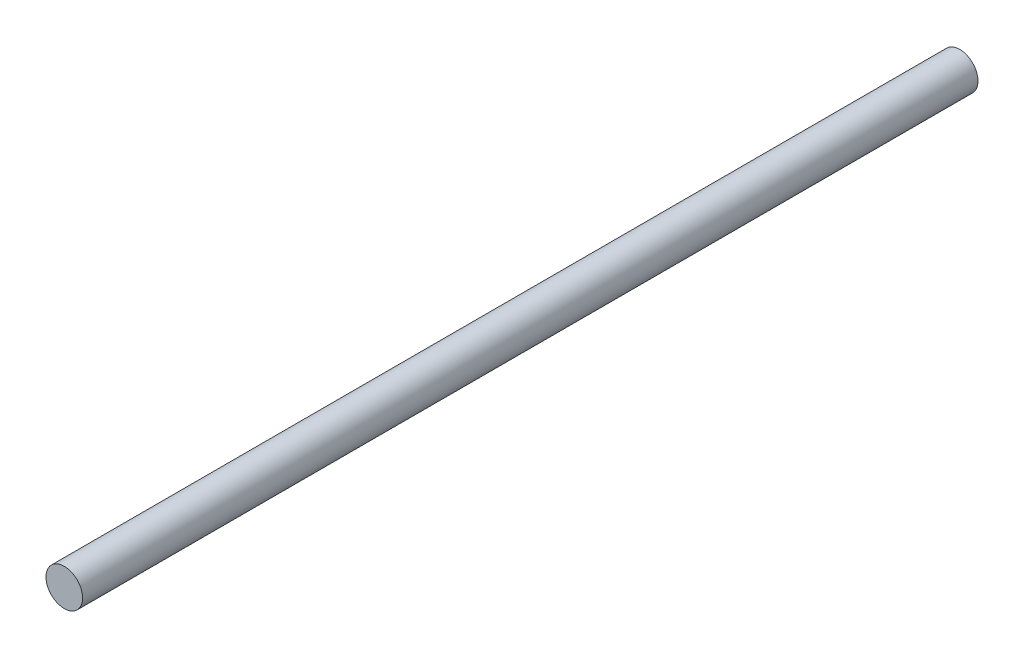
ISO-10303-21;
HEADER;
FILE_DESCRIPTION(('STEP AP214'),'2;1');
FILE_NAME('part.step','',(''),(''),'','','');
FILE_SCHEMA(('AUTOMOTIVE_DESIGN { 1 0 10303 214 1 1 1 1 }'));
ENDSEC;
DATA;
#1=APPLICATION_CONTEXT('core data for automotive mechanical design processes');
#2=APPLICATION_PROTOCOL_DEFINITION('international standard','automotive_design',2000,#1);
#3=PRODUCT_CONTEXT('',#1,'mechanical');
#4=PRODUCT('Part','Part','',(#3));
#5=PRODUCT_RELATED_PRODUCT_CATEGORY('part','',(#4));
#6=PRODUCT_DEFINITION_FORMATION('','',#4);
#7=PRODUCT_DEFINITION_CONTEXT('part definition',#1,'design');
#8=PRODUCT_DEFINITION('design','',#6,#7);
#9=PRODUCT_DEFINITION_SHAPE('','',#8);
#10=(LENGTH_UNIT() NAMED_UNIT(*) SI_UNIT(.MILLI.,.METRE.));
#11=(NAMED_UNIT(*) PLANE_ANGLE_UNIT() SI_UNIT($,.RADIAN.));
#12=(NAMED_UNIT(*) SI_UNIT($,.STERADIAN.) SOLID_ANGLE_UNIT());
#13=UNCERTAINTY_MEASURE_WITH_UNIT(LENGTH_MEASURE(1.E-05),#10,'distance_accuracy_value','');
#14=(GEOMETRIC_REPRESENTATION_CONTEXT(3) GLOBAL_UNCERTAINTY_ASSIGNED_CONTEXT((#13)) GLOBAL_UNIT_ASSIGNED_CONTEXT((#10,
#11,#12)) REPRESENTATION_CONTEXT('',''));
#15=CARTESIAN_POINT('',(0.,0.,0.));
#16=DIRECTION('',(0.,0.,1.));
#17=DIRECTION('',(1.,0.,0.));
#18=AXIS2_PLACEMENT_3D('',#15,#16,#17);
#19=CARTESIAN_POINT('',(0.,0.,186.182));
#20=DIRECTION('',(0.,0.,-1.));
#21=DIRECTION('',(-1.,0.,0.));
#22=AXIS2_PLACEMENT_3D('',#19,#20,#21);
#23=CYLINDRICAL_SURFACE('',#22,3.81);
#24=CARTESIAN_POINT('',(0.,0.,186.182));
#25=DIRECTION('',(0.,0.,1.));
#26=DIRECTION('',(1.,0.,0.));
#27=AXIS2_PLACEMENT_3D('',#24,#25,#26);
#28=CIRCLE('',#27,3.81);
#29=CARTESIAN_POINT('',(3.81,0.,186.182));
#30=VERTEX_POINT('',#29);
#31=EDGE_CURVE('E10',#30,#30,#28,.T.);
#32=ORIENTED_EDGE('',*,*,#31,.F.);
#33=EDGE_LOOP('',(#32));
#34=FACE_BOUND('',#33,.T.);
#35=CARTESIAN_POINT('',(0.,0.,0.));
#36=DIRECTION('',(0.,0.,1.));
#37=DIRECTION('',(1.,0.,0.));
#38=AXIS2_PLACEMENT_3D('',#35,#36,#37);
#39=CIRCLE('',#38,3.81);
#40=CARTESIAN_POINT('',(3.81,0.,0.));
#41=VERTEX_POINT('',#40);
#42=EDGE_CURVE('E33',#41,#41,#39,.T.);
#43=ORIENTED_EDGE('',*,*,#42,.T.);
#44=EDGE_LOOP('',(#43));
#45=FACE_BOUND('',#44,.T.);
#46=ADVANCED_FACE('F30',(#34,#45),#23,.T.);
#47=CARTESIAN_POINT('',(0.,0.,186.182));
#48=DIRECTION('',(0.,0.,1.));
#49=DIRECTION('',(1.,0.,0.));
#50=AXIS2_PLACEMENT_3D('',#47,#48,#49);
#51=PLANE('',#50);
#52=ORIENTED_EDGE('',*,*,#31,.T.);
#53=EDGE_LOOP('',(#52));
#54=FACE_BOUND('',#53,.T.);
#55=ADVANCED_FACE('F45',(#54),#51,.T.);
#56=CARTESIAN_POINT('',(0.,0.,0.));
#57=DIRECTION('',(0.,0.,1.));
#58=DIRECTION('',(1.,0.,0.));
#59=AXIS2_PLACEMENT_3D('',#56,#57,#58);
#60=PLANE('',#59);
#61=ORIENTED_EDGE('',*,*,#42,.F.);
#62=EDGE_LOOP('',(#61));
#63=FACE_BOUND('',#62,.T.);
#64=ADVANCED_FACE('F43',(#63),#60,.F.);
#65=CLOSED_SHELL('',(#46,#55,#64));
#66=MANIFOLD_SOLID_BREP('B2',#65);
#67=ADVANCED_BREP_SHAPE_REPRESENTATION('',(#18,#66),#14);
#68=SHAPE_DEFINITION_REPRESENTATION(#9,#67);
ENDSEC;
END-ISO-10303-21;
